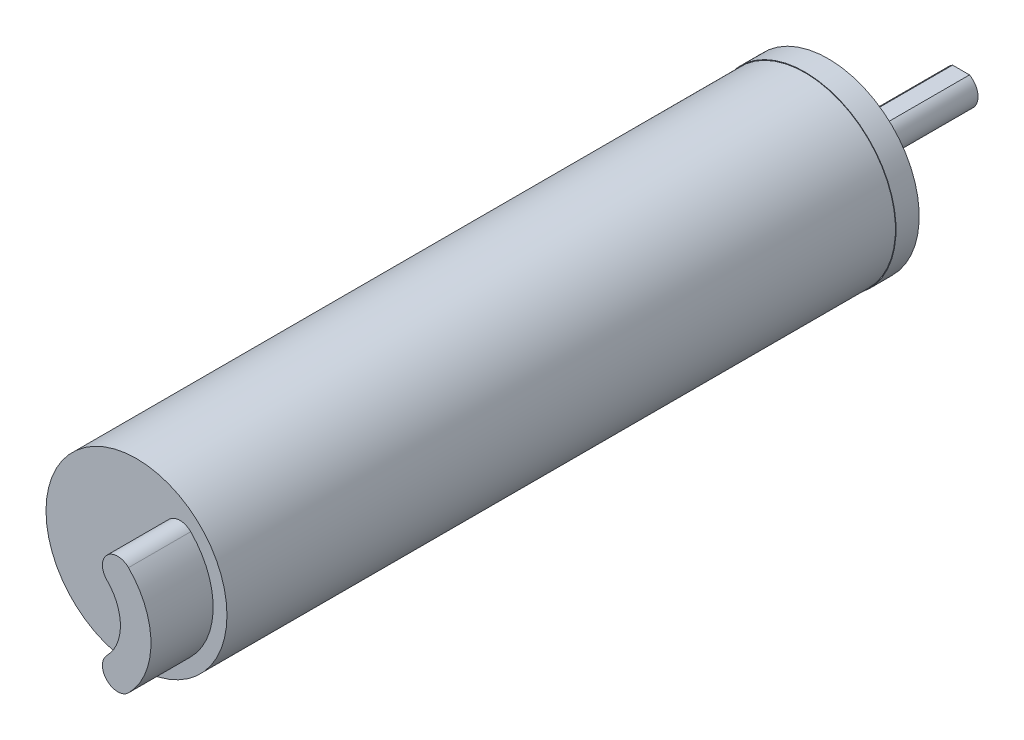
ISO-10303-21;
HEADER;
FILE_DESCRIPTION(('STEP AP214'),'2;1');
FILE_NAME('part.step','',(''),(''),'','','');
FILE_SCHEMA(('AUTOMOTIVE_DESIGN { 1 0 10303 214 1 1 1 1 }'));
ENDSEC;
DATA;
#1=APPLICATION_CONTEXT('core data for automotive mechanical design processes');
#2=APPLICATION_PROTOCOL_DEFINITION('international standard','automotive_design',2000,#1);
#3=PRODUCT_CONTEXT('',#1,'mechanical');
#4=PRODUCT('Part','Part','',(#3));
#5=PRODUCT_RELATED_PRODUCT_CATEGORY('part','',(#4));
#6=PRODUCT_DEFINITION_FORMATION('','',#4);
#7=PRODUCT_DEFINITION_CONTEXT('part definition',#1,'design');
#8=PRODUCT_DEFINITION('design','',#6,#7);
#9=PRODUCT_DEFINITION_SHAPE('','',#8);
#10=(LENGTH_UNIT() NAMED_UNIT(*) SI_UNIT(.MILLI.,.METRE.));
#11=(NAMED_UNIT(*) PLANE_ANGLE_UNIT() SI_UNIT($,.RADIAN.));
#12=(NAMED_UNIT(*) SI_UNIT($,.STERADIAN.) SOLID_ANGLE_UNIT());
#13=UNCERTAINTY_MEASURE_WITH_UNIT(LENGTH_MEASURE(1.E-05),#10,'distance_accuracy_value','');
#14=(GEOMETRIC_REPRESENTATION_CONTEXT(3) GLOBAL_UNCERTAINTY_ASSIGNED_CONTEXT((#13)) GLOBAL_UNIT_ASSIGNED_CONTEXT((#10,
#11,#12)) REPRESENTATION_CONTEXT('',''));
#15=CARTESIAN_POINT('',(0.,0.,0.));
#16=DIRECTION('',(0.,0.,1.));
#17=DIRECTION('',(1.,0.,0.));
#18=AXIS2_PLACEMENT_3D('',#15,#16,#17);
#19=CARTESIAN_POINT('',(0.,0.,61.1));
#20=DIRECTION('',(0.,0.,1.));
#21=DIRECTION('',(1.,0.,0.));
#22=AXIS2_PLACEMENT_3D('',#19,#20,#21);
#23=PLANE('',#22);
#24=CARTESIAN_POINT('',(0.,0.,61.1));
#25=DIRECTION('',(0.,0.,1.));
#26=DIRECTION('',(1.,0.,0.));
#27=AXIS2_PLACEMENT_3D('',#24,#25,#26);
#28=CIRCLE('',#27,8.);
#29=CARTESIAN_POINT('',(8.,0.,61.1));
#30=VERTEX_POINT('',#29);
#31=EDGE_CURVE('E159',#30,#30,#28,.T.);
#32=ORIENTED_EDGE('',*,*,#31,.T.);
#33=EDGE_LOOP('',(#32));
#34=FACE_BOUND('',#33,.T.);
#35=CARTESIAN_POINT('',(0.,0.,61.1));
#36=DIRECTION('',(0.,0.,1.));
#37=DIRECTION('',(1.,0.,0.));
#38=AXIS2_PLACEMENT_3D('',#35,#36,#37);
#39=CIRCLE('',#38,6.77902645922895);
#40=CARTESIAN_POINT('',(4.79349557916381,-4.79349557916383,61.1));
#41=VERTEX_POINT('',#40);
#42=CARTESIAN_POINT('',(4.79349557916381,4.79349557916383,61.1));
#43=VERTEX_POINT('',#42);
#44=EDGE_CURVE('E447',#41,#43,#39,.T.);
#45=ORIENTED_EDGE('',*,*,#44,.F.);
#46=CARTESIAN_POINT('',(3.83890142456198,-3.83890142456199,61.1));
#47=DIRECTION('',(0.,0.,1.));
#48=DIRECTION('',(1.,0.,0.));
#49=AXIS2_PLACEMENT_3D('',#46,#47,#48);
#50=CIRCLE('',#49,1.35);
#51=CARTESIAN_POINT('',(2.88430726996014,-2.88430726996015,61.1));
#52=VERTEX_POINT('',#51);
#53=EDGE_CURVE('E119',#52,#41,#50,.T.);
#54=ORIENTED_EDGE('',*,*,#53,.F.);
#55=CARTESIAN_POINT('',(0.,0.,61.1));
#56=DIRECTION('',(0.,0.,-1.));
#57=DIRECTION('',(1.,0.,0.));
#58=AXIS2_PLACEMENT_3D('',#55,#56,#57);
#59=CIRCLE('',#58,4.07902645922895);
#60=CARTESIAN_POINT('',(2.88430726996014,2.88430726996015,61.1));
#61=VERTEX_POINT('',#60);
#62=EDGE_CURVE('E115',#61,#52,#59,.T.);
#63=ORIENTED_EDGE('',*,*,#62,.F.);
#64=CARTESIAN_POINT('',(3.83890142456198,3.83890142456199,61.1));
#65=DIRECTION('',(0.,0.,1.));
#66=DIRECTION('',(1.,0.,0.));
#67=AXIS2_PLACEMENT_3D('',#64,#65,#66);
#68=CIRCLE('',#67,1.35);
#69=EDGE_CURVE('E444',#43,#61,#68,.T.);
#70=ORIENTED_EDGE('',*,*,#69,.F.);
#71=EDGE_LOOP('',(#45,#54,#63,#70));
#72=FACE_BOUND('',#71,.T.);
#73=ADVANCED_FACE('F38',(#34,#72),#23,.T.);
#74=CARTESIAN_POINT('',(0.,0.,-2.6));
#75=DIRECTION('',(0.,0.,-1.));
#76=DIRECTION('',(-1.,0.,0.));
#77=AXIS2_PLACEMENT_3D('',#74,#75,#76);
#78=PLANE('',#77);
#79=CARTESIAN_POINT('',(0.,0.,-2.6));
#80=DIRECTION('',(0.,0.,-1.));
#81=DIRECTION('',(-1.,0.,0.));
#82=AXIS2_PLACEMENT_3D('',#79,#80,#81);
#83=CIRCLE('',#82,2.75);
#84=CARTESIAN_POINT('',(-2.75,0.,-2.6));
#85=VERTEX_POINT('',#84);
#86=EDGE_CURVE('E139',#85,#85,#83,.T.);
#87=ORIENTED_EDGE('',*,*,#86,.T.);
#88=EDGE_LOOP('',(#87));
#89=FACE_BOUND('',#88,.T.);
#90=CARTESIAN_POINT('',(0.,0.,-2.6));
#91=DIRECTION('',(0.,0.,-1.));
#92=DIRECTION('',(-1.,0.,0.));
#93=AXIS2_PLACEMENT_3D('',#90,#91,#92);
#94=CIRCLE('',#93,1.5);
#95=CARTESIAN_POINT('',(-1.5,0.,-2.6));
#96=VERTEX_POINT('',#95);
#97=EDGE_CURVE('E162',#96,#96,#94,.T.);
#98=ORIENTED_EDGE('',*,*,#97,.F.);
#99=EDGE_LOOP('',(#98));
#100=FACE_BOUND('',#99,.T.);
#101=ADVANCED_FACE('F196',(#89,#100),#78,.T.);
#102=CARTESIAN_POINT('',(0.,0.,-1.));
#103=DIRECTION('',(0.,0.,-1.));
#104=DIRECTION('',(-1.,0.,0.));
#105=AXIS2_PLACEMENT_3D('',#102,#103,#104);
#106=PLANE('',#105);
#107=CARTESIAN_POINT('',(0.,0.,-1.));
#108=DIRECTION('',(0.,0.,-1.));
#109=DIRECTION('',(-1.,0.,0.));
#110=AXIS2_PLACEMENT_3D('',#107,#108,#109);
#111=CIRCLE('',#110,3.);
#112=CARTESIAN_POINT('',(-3.,0.,-1.));
#113=VERTEX_POINT('',#112);
#114=EDGE_CURVE('E142',#113,#113,#111,.T.);
#115=ORIENTED_EDGE('',*,*,#114,.T.);
#116=EDGE_LOOP('',(#115));
#117=FACE_BOUND('',#116,.T.);
#118=CARTESIAN_POINT('',(0.,0.,-1.));
#119=DIRECTION('',(0.,0.,-1.));
#120=DIRECTION('',(-1.,0.,0.));
#121=AXIS2_PLACEMENT_3D('',#118,#119,#120);
#122=CIRCLE('',#121,2.75);
#123=CARTESIAN_POINT('',(-2.75,0.,-1.));
#124=VERTEX_POINT('',#123);
#125=EDGE_CURVE('E143',#124,#124,#122,.T.);
#126=ORIENTED_EDGE('',*,*,#125,.F.);
#127=EDGE_LOOP('',(#126));
#128=FACE_BOUND('',#127,.T.);
#129=ADVANCED_FACE('F202',(#117,#128),#106,.T.);
#130=CARTESIAN_POINT('',(0.,0.,-1.));
#131=DIRECTION('',(0.,0.,1.));
#132=DIRECTION('',(1.,0.,0.));
#133=AXIS2_PLACEMENT_3D('',#130,#131,#132);
#134=CYLINDRICAL_SURFACE('',#133,3.);
#135=CARTESIAN_POINT('',(0.,0.,-0.05));
#136=DIRECTION('',(0.,0.,-1.));
#137=DIRECTION('',(-1.,0.,0.));
#138=AXIS2_PLACEMENT_3D('',#135,#136,#137);
#139=CIRCLE('',#138,3.);
#140=CARTESIAN_POINT('',(-3.,0.,-0.05));
#141=VERTEX_POINT('',#140);
#142=EDGE_CURVE('E138',#141,#141,#139,.T.);
#143=ORIENTED_EDGE('',*,*,#142,.T.);
#144=EDGE_LOOP('',(#143));
#145=FACE_BOUND('',#144,.T.);
#146=ORIENTED_EDGE('',*,*,#114,.F.);
#147=EDGE_LOOP('',(#146));
#148=FACE_BOUND('',#147,.T.);
#149=ADVANCED_FACE('F248',(#145,#148),#134,.T.);
#150=CARTESIAN_POINT('',(0.,0.,-2.6));
#151=DIRECTION('',(0.,0.,1.));
#152=DIRECTION('',(1.,0.,0.));
#153=AXIS2_PLACEMENT_3D('',#150,#151,#152);
#154=CYLINDRICAL_SURFACE('',#153,2.75);
#155=ORIENTED_EDGE('',*,*,#86,.F.);
#156=EDGE_LOOP('',(#155));
#157=FACE_BOUND('',#156,.T.);
#158=ORIENTED_EDGE('',*,*,#125,.T.);
#159=EDGE_LOOP('',(#158));
#160=FACE_BOUND('',#159,.T.);
#161=ADVANCED_FACE('F244',(#157,#160),#154,.T.);
#162=CARTESIAN_POINT('',(0.,0.,-11.8));
#163=DIRECTION('',(0.,0.,-1.));
#164=DIRECTION('',(-1.,0.,0.));
#165=AXIS2_PLACEMENT_3D('',#162,#163,#164);
#166=PLANE('',#165);
#167=CARTESIAN_POINT('',(0.,0.,-11.8));
#168=DIRECTION('',(0.,0.,-1.));
#169=DIRECTION('',(-1.,0.,0.));
#170=AXIS2_PLACEMENT_3D('',#167,#168,#169);
#171=CIRCLE('',#170,1.5);
#172=CARTESIAN_POINT('',(0.748331477354788,1.3,-11.8));
#173=VERTEX_POINT('',#172);
#174=CARTESIAN_POINT('',(-0.748331477354788,1.3,-11.8));
#175=VERTEX_POINT('',#174);
#176=EDGE_CURVE('E148',#173,#175,#171,.T.);
#177=ORIENTED_EDGE('',*,*,#176,.T.);
#178=DIRECTION('',(1.,0.,0.));
#179=VECTOR('',#178,1.);
#180=CARTESIAN_POINT('',(0.748331477354788,1.3,-11.8));
#181=LINE('',#180,#179);
#182=EDGE_CURVE('E151',#175,#173,#181,.T.);
#183=ORIENTED_EDGE('',*,*,#182,.T.);
#184=EDGE_LOOP('',(#177,#183));
#185=FACE_BOUND('',#184,.T.);
#186=ADVANCED_FACE('F247',(#185),#166,.T.);
#187=CARTESIAN_POINT('',(0.,0.,-11.8));
#188=DIRECTION('',(0.,0.,1.));
#189=DIRECTION('',(1.,0.,0.));
#190=AXIS2_PLACEMENT_3D('',#187,#188,#189);
#191=CYLINDRICAL_SURFACE('',#190,1.5);
#192=DIRECTION('',(0.,0.,1.));
#193=VECTOR('',#192,1.);
#194=CARTESIAN_POINT('',(0.748331477354788,1.3,-11.8));
#195=LINE('',#194,#193);
#196=CARTESIAN_POINT('',(0.748331477354788,1.3,-4.));
#197=VERTEX_POINT('',#196);
#198=EDGE_CURVE('E153',#173,#197,#195,.T.);
#199=ORIENTED_EDGE('',*,*,#198,.T.);
#200=CARTESIAN_POINT('',(0.,0.,-4.));
#201=DIRECTION('',(0.,0.,-1.));
#202=DIRECTION('',(-1.,0.,0.));
#203=AXIS2_PLACEMENT_3D('',#200,#201,#202);
#204=CIRCLE('',#203,1.5);
#205=CARTESIAN_POINT('',(-0.748331477354789,1.3,-4.));
#206=VERTEX_POINT('',#205);
#207=EDGE_CURVE('E60',#206,#197,#204,.T.);
#208=ORIENTED_EDGE('',*,*,#207,.F.);
#209=DIRECTION('',(0.,0.,1.));
#210=VECTOR('',#209,1.);
#211=CARTESIAN_POINT('',(-0.748331477354788,1.3,-11.8));
#212=LINE('',#211,#210);
#213=EDGE_CURVE('E156',#175,#206,#212,.T.);
#214=ORIENTED_EDGE('',*,*,#213,.F.);
#215=ORIENTED_EDGE('',*,*,#176,.F.);
#216=EDGE_LOOP('',(#199,#208,#214,#215));
#217=FACE_BOUND('',#216,.T.);
#218=ORIENTED_EDGE('',*,*,#97,.T.);
#219=EDGE_LOOP('',(#218));
#220=FACE_BOUND('',#219,.T.);
#221=ADVANCED_FACE('F208',(#217,#220),#191,.T.);
#222=CARTESIAN_POINT('',(0.748331477354788,1.3,-11.8));
#223=DIRECTION('',(0.,-1.,0.));
#224=DIRECTION('',(0.,0.,-1.));
#225=AXIS2_PLACEMENT_3D('',#222,#223,#224);
#226=PLANE('',#225);
#227=ORIENTED_EDGE('',*,*,#213,.T.);
#228=DIRECTION('',(1.,0.,0.));
#229=VECTOR('',#228,1.);
#230=CARTESIAN_POINT('',(0.748331477354788,1.3,-4.));
#231=LINE('',#230,#229);
#232=EDGE_CURVE('E11',#206,#197,#231,.T.);
#233=ORIENTED_EDGE('',*,*,#232,.T.);
#234=ORIENTED_EDGE('',*,*,#198,.F.);
#235=ORIENTED_EDGE('',*,*,#182,.F.);
#236=EDGE_LOOP('',(#227,#233,#234,#235));
#237=FACE_BOUND('',#236,.T.);
#238=ADVANCED_FACE('F231',(#237),#226,.F.);
#239=CARTESIAN_POINT('',(0.,0.,2.));
#240=DIRECTION('',(0.,0.,-1.));
#241=DIRECTION('',(-1.,0.,0.));
#242=AXIS2_PLACEMENT_3D('',#239,#240,#241);
#243=PLANE('',#242);
#244=CARTESIAN_POINT('',(0.,0.,2.));
#245=DIRECTION('',(0.,0.,-1.));
#246=DIRECTION('',(-1.,0.,0.));
#247=AXIS2_PLACEMENT_3D('',#244,#245,#246);
#248=CIRCLE('',#247,8.05);
#249=CARTESIAN_POINT('',(-8.05,0.,2.));
#250=VERTEX_POINT('',#249);
#251=EDGE_CURVE('E132',#250,#250,#248,.T.);
#252=ORIENTED_EDGE('',*,*,#251,.F.);
#253=EDGE_LOOP('',(#252));
#254=FACE_BOUND('',#253,.T.);
#255=CARTESIAN_POINT('',(0.,0.,2.));
#256=DIRECTION('',(0.,0.,-1.));
#257=DIRECTION('',(-1.,0.,0.));
#258=AXIS2_PLACEMENT_3D('',#255,#256,#257);
#259=CIRCLE('',#258,8.);
#260=CARTESIAN_POINT('',(-8.,0.,2.));
#261=VERTEX_POINT('',#260);
#262=EDGE_CURVE('E165',#261,#261,#259,.T.);
#263=ORIENTED_EDGE('',*,*,#262,.T.);
#264=EDGE_LOOP('',(#263));
#265=FACE_BOUND('',#264,.T.);
#266=ADVANCED_FACE('F229',(#254,#265),#243,.F.);
#267=CARTESIAN_POINT('',(0.,0.,-0.05));
#268=DIRECTION('',(0.,0.,-1.));
#269=DIRECTION('',(-1.,0.,0.));
#270=AXIS2_PLACEMENT_3D('',#267,#268,#269);
#271=PLANE('',#270);
#272=CARTESIAN_POINT('',(-5.,0.,-0.05));
#273=DIRECTION('',(0.,0.,-1.));
#274=DIRECTION('',(-1.,0.,0.));
#275=AXIS2_PLACEMENT_3D('',#272,#273,#274);
#276=CIRCLE('',#275,1.05000000000001);
#277=CARTESIAN_POINT('',(-6.05000000000001,0.,-0.05));
#278=VERTEX_POINT('',#277);
#279=EDGE_CURVE('E176',#278,#278,#276,.F.);
#280=ORIENTED_EDGE('',*,*,#279,.T.);
#281=EDGE_LOOP('',(#280));
#282=FACE_BOUND('',#281,.T.);
#283=CARTESIAN_POINT('',(5.,0.,-0.05));
#284=DIRECTION('',(0.,0.,-1.));
#285=DIRECTION('',(-1.,0.,0.));
#286=AXIS2_PLACEMENT_3D('',#283,#284,#285);
#287=CIRCLE('',#286,1.05000000000001);
#288=CARTESIAN_POINT('',(3.94999999999999,0.,-0.05));
#289=VERTEX_POINT('',#288);
#290=EDGE_CURVE('E173',#289,#289,#287,.F.);
#291=ORIENTED_EDGE('',*,*,#290,.T.);
#292=EDGE_LOOP('',(#291));
#293=FACE_BOUND('',#292,.T.);
#294=CARTESIAN_POINT('',(0.,0.,-0.05));
#295=DIRECTION('',(0.,0.,-1.));
#296=DIRECTION('',(-1.,0.,0.));
#297=AXIS2_PLACEMENT_3D('',#294,#295,#296);
#298=CIRCLE('',#297,8.05);
#299=CARTESIAN_POINT('',(-8.05,0.,-0.05));
#300=VERTEX_POINT('',#299);
#301=EDGE_CURVE('E135',#300,#300,#298,.T.);
#302=ORIENTED_EDGE('',*,*,#301,.T.);
#303=EDGE_LOOP('',(#302));
#304=FACE_BOUND('',#303,.T.);
#305=ORIENTED_EDGE('',*,*,#142,.F.);
#306=EDGE_LOOP('',(#305));
#307=FACE_BOUND('',#306,.T.);
#308=ADVANCED_FACE('F222',(#282,#293,#304,#307),#271,.T.);
#309=CARTESIAN_POINT('',(0.,0.,-0.05));
#310=DIRECTION('',(0.,0.,1.));
#311=DIRECTION('',(1.,0.,0.));
#312=AXIS2_PLACEMENT_3D('',#309,#310,#311);
#313=CYLINDRICAL_SURFACE('',#312,8.05);
#314=ORIENTED_EDGE('',*,*,#301,.F.);
#315=EDGE_LOOP('',(#314));
#316=FACE_BOUND('',#315,.T.);
#317=ORIENTED_EDGE('',*,*,#251,.T.);
#318=EDGE_LOOP('',(#317));
#319=FACE_BOUND('',#318,.T.);
#320=ADVANCED_FACE('F213',(#316,#319),#313,.T.);
#321=CARTESIAN_POINT('',(0.,0.,61.1));
#322=DIRECTION('',(0.,0.,-1.));
#323=DIRECTION('',(-1.,0.,0.));
#324=AXIS2_PLACEMENT_3D('',#321,#322,#323);
#325=CYLINDRICAL_SURFACE('',#324,8.);
#326=ORIENTED_EDGE('',*,*,#31,.F.);
#327=EDGE_LOOP('',(#326));
#328=FACE_BOUND('',#327,.T.);
#329=ORIENTED_EDGE('',*,*,#262,.F.);
#330=EDGE_LOOP('',(#329));
#331=FACE_BOUND('',#330,.T.);
#332=ADVANCED_FACE('F210',(#328,#331),#325,.T.);
#333=CARTESIAN_POINT('',(-5.,0.,5.15));
#334=DIRECTION('',(0.,0.,-1.));
#335=DIRECTION('',(-1.,0.,0.));
#336=AXIS2_PLACEMENT_3D('',#333,#334,#335);
#337=CONICAL_SURFACE('',#336,0.799999999999998,1.02974425867665);
#338=CARTESIAN_POINT('',(-5.,0.,5.63068849522205));
#339=VERTEX_POINT('',#338);
#340=VERTEX_LOOP('',#339);
#341=FACE_BOUND('',#340,.T.);
#342=CARTESIAN_POINT('',(-5.,0.,5.15));
#343=DIRECTION('',(0.,0.,-1.));
#344=DIRECTION('',(-1.,0.,0.));
#345=AXIS2_PLACEMENT_3D('',#342,#343,#344);
#346=CIRCLE('',#345,0.799999999999998);
#347=CARTESIAN_POINT('',(-5.8,0.,5.15));
#348=VERTEX_POINT('',#347);
#349=EDGE_CURVE('E129',#348,#348,#346,.T.);
#350=ORIENTED_EDGE('',*,*,#349,.T.);
#351=EDGE_LOOP('',(#350));
#352=FACE_BOUND('',#351,.T.);
#353=ADVANCED_FACE('F212',(#341,#352),#337,.F.);
#354=CARTESIAN_POINT('',(-5.,0.,-0.05));
#355=DIRECTION('',(0.,0.,-1.));
#356=DIRECTION('',(-1.,0.,0.));
#357=AXIS2_PLACEMENT_3D('',#354,#355,#356);
#358=CYLINDRICAL_SURFACE('',#357,0.799999999999998);
#359=CARTESIAN_POINT('',(-5.,0.,0.200000000000014));
#360=DIRECTION('',(0.,0.,-1.));
#361=DIRECTION('',(-1.,0.,0.));
#362=AXIS2_PLACEMENT_3D('',#359,#360,#361);
#363=CIRCLE('',#362,0.799999999999998);
#364=CARTESIAN_POINT('',(-5.8,0.,0.200000000000014));
#365=VERTEX_POINT('',#364);
#366=EDGE_CURVE('E170',#365,#365,#363,.T.);
#367=ORIENTED_EDGE('',*,*,#366,.T.);
#368=EDGE_LOOP('',(#367));
#369=FACE_BOUND('',#368,.T.);
#370=ORIENTED_EDGE('',*,*,#349,.F.);
#371=EDGE_LOOP('',(#370));
#372=FACE_BOUND('',#371,.T.);
#373=ADVANCED_FACE('F219',(#369,#372),#358,.F.);
#374=CARTESIAN_POINT('',(5.,0.,5.15));
#375=DIRECTION('',(0.,0.,-1.));
#376=DIRECTION('',(-1.,0.,0.));
#377=AXIS2_PLACEMENT_3D('',#374,#375,#376);
#378=CONICAL_SURFACE('',#377,0.799999999999998,1.02974425867665);
#379=CARTESIAN_POINT('',(5.,0.,5.63068849522205));
#380=VERTEX_POINT('',#379);
#381=VERTEX_LOOP('',#380);
#382=FACE_BOUND('',#381,.T.);
#383=CARTESIAN_POINT('',(5.,0.,5.15));
#384=DIRECTION('',(0.,0.,-1.));
#385=DIRECTION('',(-1.,0.,0.));
#386=AXIS2_PLACEMENT_3D('',#383,#384,#385);
#387=CIRCLE('',#386,0.799999999999998);
#388=CARTESIAN_POINT('',(4.2,0.,5.15));
#389=VERTEX_POINT('',#388);
#390=EDGE_CURVE('E122',#389,#389,#387,.T.);
#391=ORIENTED_EDGE('',*,*,#390,.T.);
#392=EDGE_LOOP('',(#391));
#393=FACE_BOUND('',#392,.T.);
#394=ADVANCED_FACE('F337',(#382,#393),#378,.F.);
#395=CARTESIAN_POINT('',(5.,0.,-0.05));
#396=DIRECTION('',(0.,0.,-1.));
#397=DIRECTION('',(-1.,0.,0.));
#398=AXIS2_PLACEMENT_3D('',#395,#396,#397);
#399=CYLINDRICAL_SURFACE('',#398,0.799999999999998);
#400=CARTESIAN_POINT('',(5.,0.,0.200000000000014));
#401=DIRECTION('',(0.,0.,-1.));
#402=DIRECTION('',(-1.,0.,0.));
#403=AXIS2_PLACEMENT_3D('',#400,#401,#402);
#404=CIRCLE('',#403,0.799999999999998);
#405=CARTESIAN_POINT('',(4.2,0.,0.200000000000014));
#406=VERTEX_POINT('',#405);
#407=EDGE_CURVE('E46',#406,#406,#404,.T.);
#408=ORIENTED_EDGE('',*,*,#407,.T.);
#409=EDGE_LOOP('',(#408));
#410=FACE_BOUND('',#409,.T.);
#411=ORIENTED_EDGE('',*,*,#390,.F.);
#412=EDGE_LOOP('',(#411));
#413=FACE_BOUND('',#412,.T.);
#414=ADVANCED_FACE('F181',(#410,#413),#399,.F.);
#415=CARTESIAN_POINT('',(-5.,0.,0.200000000000014));
#416=DIRECTION('',(0.,0.,-1.));
#417=DIRECTION('',(-1.,0.,0.));
#418=AXIS2_PLACEMENT_3D('',#415,#416,#417);
#419=CONICAL_SURFACE('',#418,0.799999999999998,0.785398163397441);
#420=ORIENTED_EDGE('',*,*,#279,.F.);
#421=EDGE_LOOP('',(#420));
#422=FACE_BOUND('',#421,.T.);
#423=ORIENTED_EDGE('',*,*,#366,.F.);
#424=EDGE_LOOP('',(#423));
#425=FACE_BOUND('',#424,.T.);
#426=ADVANCED_FACE('F186',(#422,#425),#419,.F.);
#427=CARTESIAN_POINT('',(5.,0.,0.200000000000014));
#428=DIRECTION('',(0.,0.,-1.));
#429=DIRECTION('',(-1.,0.,0.));
#430=AXIS2_PLACEMENT_3D('',#427,#428,#429);
#431=CONICAL_SURFACE('',#430,0.799999999999998,0.785398163397441);
#432=ORIENTED_EDGE('',*,*,#290,.F.);
#433=EDGE_LOOP('',(#432));
#434=FACE_BOUND('',#433,.T.);
#435=ORIENTED_EDGE('',*,*,#407,.F.);
#436=EDGE_LOOP('',(#435));
#437=FACE_BOUND('',#436,.T.);
#438=ADVANCED_FACE('F40',(#434,#437),#431,.F.);
#439=CARTESIAN_POINT('',(0.,0.,-4.));
#440=DIRECTION('',(0.,0.,-1.));
#441=DIRECTION('',(-1.,0.,0.));
#442=AXIS2_PLACEMENT_3D('',#439,#440,#441);
#443=PLANE('',#442);
#444=ORIENTED_EDGE('',*,*,#232,.F.);
#445=ORIENTED_EDGE('',*,*,#207,.T.);
#446=EDGE_LOOP('',(#444,#445));
#447=FACE_BOUND('',#446,.T.);
#448=ADVANCED_FACE('F185',(#447),#443,.T.);
#449=CARTESIAN_POINT('',(3.83890142456198,-3.83890142456199,66.6));
#450=DIRECTION('',(0.,0.,-1.));
#451=DIRECTION('',(-1.,0.,0.));
#452=AXIS2_PLACEMENT_3D('',#449,#450,#451);
#453=CYLINDRICAL_SURFACE('',#452,1.35);
#454=ORIENTED_EDGE('',*,*,#53,.T.);
#455=DIRECTION('',(0.,0.,-1.));
#456=VECTOR('',#455,1.);
#457=CARTESIAN_POINT('',(4.79349557916381,-4.79349557916383,66.6));
#458=LINE('',#457,#456);
#459=CARTESIAN_POINT('',(4.79349557916381,-4.79349557916383,66.6));
#460=VERTEX_POINT('',#459);
#461=EDGE_CURVE('E100',#460,#41,#458,.T.);
#462=ORIENTED_EDGE('',*,*,#461,.F.);
#463=CARTESIAN_POINT('',(3.83890142456198,-3.83890142456199,66.6));
#464=DIRECTION('',(0.,0.,1.));
#465=DIRECTION('',(1.,0.,0.));
#466=AXIS2_PLACEMENT_3D('',#463,#464,#465);
#467=CIRCLE('',#466,1.35);
#468=CARTESIAN_POINT('',(2.88430726996014,-2.88430726996015,66.6));
#469=VERTEX_POINT('',#468);
#470=EDGE_CURVE('E107',#469,#460,#467,.T.);
#471=ORIENTED_EDGE('',*,*,#470,.F.);
#472=DIRECTION('',(0.,0.,-1.));
#473=VECTOR('',#472,1.);
#474=CARTESIAN_POINT('',(2.88430726996014,-2.88430726996015,66.6));
#475=LINE('',#474,#473);
#476=EDGE_CURVE('E442',#469,#52,#475,.T.);
#477=ORIENTED_EDGE('',*,*,#476,.T.);
#478=EDGE_LOOP('',(#454,#462,#471,#477));
#479=FACE_BOUND('',#478,.T.);
#480=ADVANCED_FACE('F117',(#479),#453,.T.);
#481=CARTESIAN_POINT('',(0.,0.,66.6));
#482=DIRECTION('',(0.,0.,-1.));
#483=DIRECTION('',(-1.,0.,0.));
#484=AXIS2_PLACEMENT_3D('',#481,#482,#483);
#485=CYLINDRICAL_SURFACE('',#484,6.77902645922895);
#486=ORIENTED_EDGE('',*,*,#44,.T.);
#487=DIRECTION('',(0.,0.,-1.));
#488=VECTOR('',#487,1.);
#489=CARTESIAN_POINT('',(4.79349557916381,4.79349557916383,66.6));
#490=LINE('',#489,#488);
#491=CARTESIAN_POINT('',(4.79349557916381,4.79349557916383,66.6));
#492=VERTEX_POINT('',#491);
#493=EDGE_CURVE('E103',#492,#43,#490,.T.);
#494=ORIENTED_EDGE('',*,*,#493,.F.);
#495=CARTESIAN_POINT('',(0.,0.,66.6));
#496=DIRECTION('',(0.,0.,1.));
#497=DIRECTION('',(1.,0.,0.));
#498=AXIS2_PLACEMENT_3D('',#495,#496,#497);
#499=CIRCLE('',#498,6.77902645922895);
#500=EDGE_CURVE('E96',#460,#492,#499,.T.);
#501=ORIENTED_EDGE('',*,*,#500,.F.);
#502=ORIENTED_EDGE('',*,*,#461,.T.);
#503=EDGE_LOOP('',(#486,#494,#501,#502));
#504=FACE_BOUND('',#503,.T.);
#505=ADVANCED_FACE('F98',(#504),#485,.T.);
#506=CARTESIAN_POINT('',(3.83890142456198,3.83890142456199,66.6));
#507=DIRECTION('',(0.,0.,-1.));
#508=DIRECTION('',(-1.,0.,0.));
#509=AXIS2_PLACEMENT_3D('',#506,#507,#508);
#510=CYLINDRICAL_SURFACE('',#509,1.35);
#511=ORIENTED_EDGE('',*,*,#69,.T.);
#512=DIRECTION('',(0.,0.,-1.));
#513=VECTOR('',#512,1.);
#514=CARTESIAN_POINT('',(2.88430726996014,2.88430726996015,66.6));
#515=LINE('',#514,#513);
#516=CARTESIAN_POINT('',(2.88430726996014,2.88430726996015,66.6));
#517=VERTEX_POINT('',#516);
#518=EDGE_CURVE('E53',#517,#61,#515,.T.);
#519=ORIENTED_EDGE('',*,*,#518,.F.);
#520=CARTESIAN_POINT('',(3.83890142456198,3.83890142456199,66.6));
#521=DIRECTION('',(0.,0.,1.));
#522=DIRECTION('',(1.,0.,0.));
#523=AXIS2_PLACEMENT_3D('',#520,#521,#522);
#524=CIRCLE('',#523,1.35);
#525=EDGE_CURVE('E106',#492,#517,#524,.T.);
#526=ORIENTED_EDGE('',*,*,#525,.F.);
#527=ORIENTED_EDGE('',*,*,#493,.T.);
#528=EDGE_LOOP('',(#511,#519,#526,#527));
#529=FACE_BOUND('',#528,.T.);
#530=ADVANCED_FACE('F304',(#529),#510,.T.);
#531=CARTESIAN_POINT('',(0.,0.,66.6));
#532=DIRECTION('',(0.,0.,-1.));
#533=DIRECTION('',(-1.,0.,0.));
#534=AXIS2_PLACEMENT_3D('',#531,#532,#533);
#535=CYLINDRICAL_SURFACE('',#534,4.07902645922895);
#536=ORIENTED_EDGE('',*,*,#62,.T.);
#537=ORIENTED_EDGE('',*,*,#476,.F.);
#538=CARTESIAN_POINT('',(0.,0.,66.6));
#539=DIRECTION('',(0.,0.,-1.));
#540=DIRECTION('',(1.,0.,0.));
#541=AXIS2_PLACEMENT_3D('',#538,#539,#540);
#542=CIRCLE('',#541,4.07902645922895);
#543=EDGE_CURVE('E111',#517,#469,#542,.T.);
#544=ORIENTED_EDGE('',*,*,#543,.F.);
#545=ORIENTED_EDGE('',*,*,#518,.T.);
#546=EDGE_LOOP('',(#536,#537,#544,#545));
#547=FACE_BOUND('',#546,.T.);
#548=ADVANCED_FACE('F313',(#547),#535,.F.);
#549=CARTESIAN_POINT('',(1.91945071228099,-1.919450712281,66.6));
#550=DIRECTION('',(0.,0.,1.));
#551=DIRECTION('',(1.,0.,0.));
#552=AXIS2_PLACEMENT_3D('',#549,#550,#551);
#553=PLANE('',#552);
#554=ORIENTED_EDGE('',*,*,#470,.T.);
#555=ORIENTED_EDGE('',*,*,#500,.T.);
#556=ORIENTED_EDGE('',*,*,#525,.T.);
#557=ORIENTED_EDGE('',*,*,#543,.T.);
#558=EDGE_LOOP('',(#554,#555,#556,#557));
#559=FACE_BOUND('',#558,.T.);
#560=ADVANCED_FACE('F110',(#559),#553,.T.);
#561=CLOSED_SHELL('',(#73,#101,#129,#149,#161,#186,#221,#238,#266,#308,#320,#332,#353,#373,#394,
#414,#426,#438,#448,#480,#505,#530,#548,#560));
#562=MANIFOLD_SOLID_BREP('B2',#561);
#563=ADVANCED_BREP_SHAPE_REPRESENTATION('',(#18,#562),#14);
#564=SHAPE_DEFINITION_REPRESENTATION(#9,#563);
ENDSEC;
END-ISO-10303-21;
